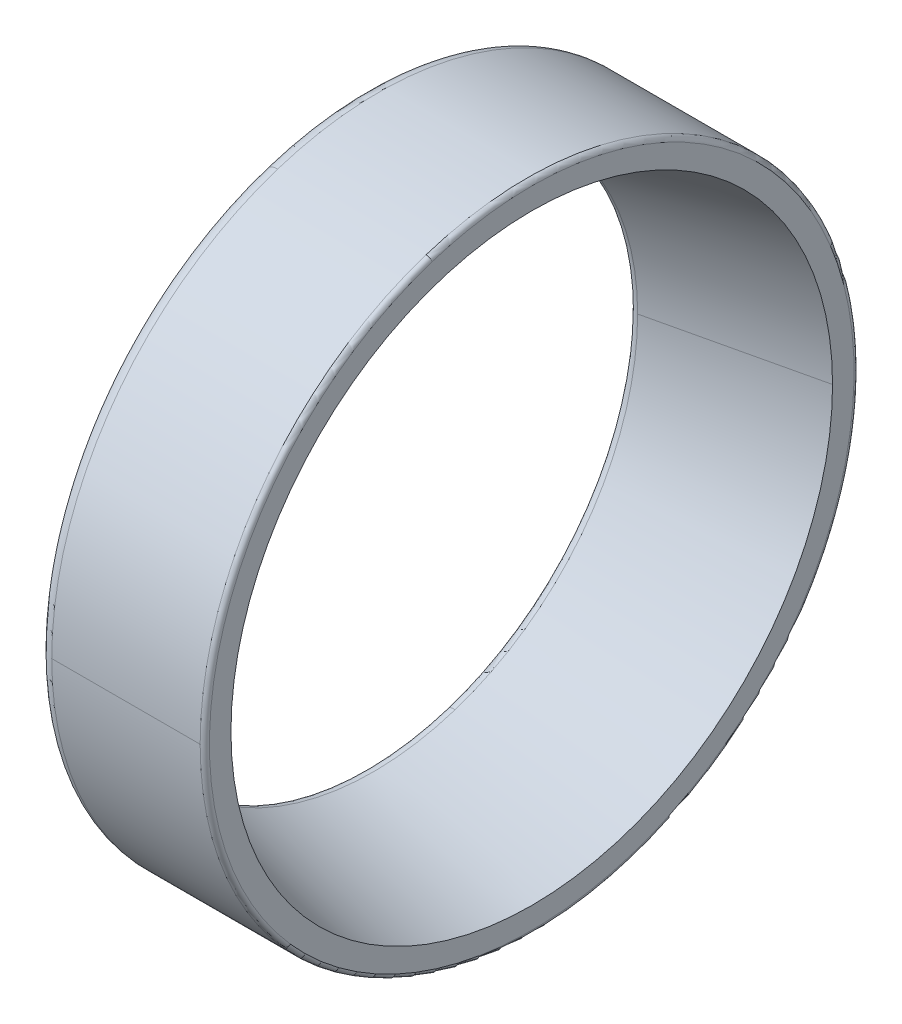
ISO-10303-21;
HEADER;
FILE_DESCRIPTION(('STEP AP214'),'2;1');
FILE_NAME('part.step','',(''),(''),'','','');
FILE_SCHEMA(('AUTOMOTIVE_DESIGN { 1 0 10303 214 1 1 1 1 }'));
ENDSEC;
DATA;
#1=APPLICATION_CONTEXT('core data for automotive mechanical design processes');
#2=APPLICATION_PROTOCOL_DEFINITION('international standard','automotive_design',2000,#1);
#3=PRODUCT_CONTEXT('',#1,'mechanical');
#4=PRODUCT('Part','Part','',(#3));
#5=PRODUCT_RELATED_PRODUCT_CATEGORY('part','',(#4));
#6=PRODUCT_DEFINITION_FORMATION('','',#4);
#7=PRODUCT_DEFINITION_CONTEXT('part definition',#1,'design');
#8=PRODUCT_DEFINITION('design','',#6,#7);
#9=PRODUCT_DEFINITION_SHAPE('','',#8);
#10=(LENGTH_UNIT() NAMED_UNIT(*) SI_UNIT(.MILLI.,.METRE.));
#11=(NAMED_UNIT(*) PLANE_ANGLE_UNIT() SI_UNIT($,.RADIAN.));
#12=(NAMED_UNIT(*) SI_UNIT($,.STERADIAN.) SOLID_ANGLE_UNIT());
#13=UNCERTAINTY_MEASURE_WITH_UNIT(LENGTH_MEASURE(1.E-05),#10,'distance_accuracy_value','');
#14=(GEOMETRIC_REPRESENTATION_CONTEXT(3) GLOBAL_UNCERTAINTY_ASSIGNED_CONTEXT((#13)) GLOBAL_UNIT_ASSIGNED_CONTEXT((#10,
#11,#12)) REPRESENTATION_CONTEXT('',''));
#15=CARTESIAN_POINT('',(0.,0.,0.));
#16=DIRECTION('',(0.,0.,1.));
#17=DIRECTION('',(1.,0.,0.));
#18=AXIS2_PLACEMENT_3D('',#15,#16,#17);
#19=CARTESIAN_POINT('',(0.,22.5,0.));
#20=DIRECTION('',(-1.,0.,0.));
#21=DIRECTION('',(0.,0.,1.));
#22=AXIS2_PLACEMENT_3D('',#19,#20,#21);
#23=PLANE('',#22);
#24=CARTESIAN_POINT('',(0.,0.,0.));
#25=DIRECTION('',(1.,0.,0.));
#26=DIRECTION('',(0.,0.,-1.));
#27=AXIS2_PLACEMENT_3D('',#24,#25,#26);
#28=CIRCLE('',#27,19.487480423777);
#29=CARTESIAN_POINT('',(0.,18.5336952432076,6.02196262849627));
#30=VERTEX_POINT('',#29);
#31=CARTESIAN_POINT('',(0.,-18.5336952432076,-6.02196262849627));
#32=VERTEX_POINT('',#31);
#33=EDGE_CURVE('E11',#30,#32,#28,.T.);
#34=ORIENTED_EDGE('',*,*,#33,.T.);
#35=CARTESIAN_POINT('',(0.,-18.5336952432074,-6.02196262849619));
#36=CARTESIAN_POINT('',(0.,-17.5877291455787,-8.93320142960304));
#37=CARTESIAN_POINT('',(0.,-16.070378082171,-11.6588767741421));
#38=CARTESIAN_POINT('',(0.,-14.0292300530316,-14.0486252637431));
#39=CARTESIAN_POINT('',(0.,-9.11994508389256,-17.8988932024731));
#40=CARTESIAN_POINT('',(0.,-3.11940368420394,-19.6074771216242));
#41=CARTESIAN_POINT('',(0.,0.0137152340265213,-19.8540642709582));
#42=CARTESIAN_POINT('',(0.,6.20765248041568,-19.1051898434805));
#43=CARTESIAN_POINT('',(0.,11.6588303191269,-16.0703370149102));
#44=CARTESIAN_POINT('',(0.,14.0486364795895,-14.0292427266901));
#45=CARTESIAN_POINT('',(0.,17.8988960174071,-9.11993955927373));
#46=CARTESIAN_POINT('',(0.,19.60746027591,-3.11940205978312));
#47=CARTESIAN_POINT('',(0.,19.854124800643,0.013701789860014));
#48=CARTESIAN_POINT('',(0.,19.4795758273155,3.11069604236225));
#49=CARTESIAN_POINT('',(0.,18.5336952432074,6.02196262849619));
#50=B_SPLINE_CURVE_WITH_KNOTS('',5,(#35,#36,#37,#38,#39,#40,#41,#42,#43,#44,#45,#46,#47,#48,
#49),.UNSPECIFIED.,.F.,.F.,(6,3,3,3,6),(0.,0.785398163397448,1.5707963267949,2.35619449019234,
3.14159265358979),.UNSPECIFIED.);
#51=EDGE_CURVE('E26',#32,#30,#50,.T.);
#52=ORIENTED_EDGE('',*,*,#51,.T.);
#53=EDGE_LOOP('',(#34,#52));
#54=FACE_BOUND('',#53,.T.);
#55=CARTESIAN_POINT('',(0.,21.3987716166417,6.95288237343662));
#56=CARTESIAN_POINT('',(0.,21.2850126572293,7.3030217220911));
#57=CARTESIAN_POINT('',(0.,21.1626456683913,7.65036345373054));
#58=CARTESIAN_POINT('',(0.,20.9010225138833,8.33862710388886));
#59=CARTESIAN_POINT('',(0.,20.7617663482132,8.67954902240772));
#60=CARTESIAN_POINT('',(0.,20.4666917220594,9.35414846723436));
#61=CARTESIAN_POINT('',(0.,20.3108732615757,9.68782599354214));
#62=CARTESIAN_POINT('',(0.,19.983051730017,10.3471336713047));
#63=CARTESIAN_POINT('',(0.,19.8110486589419,10.6727638227596));
#64=CARTESIAN_POINT('',(0.,19.4512716593353,11.3151920446043));
#65=CARTESIAN_POINT('',(0.,19.2634977308038,11.6319901149941));
#66=CARTESIAN_POINT('',(0.,18.872631545538,12.2559910432847));
#67=CARTESIAN_POINT('',(0.,18.6695392888038,12.5631939011855));
#68=CARTESIAN_POINT('',(0.,18.2485256698456,13.167264309058));
#69=CARTESIAN_POINT('',(0.,18.0306043076216,13.4641318590298));
#70=CARTESIAN_POINT('',(0.,17.5804574812093,14.046816475628));
#71=CARTESIAN_POINT('',(0.,17.348232017021,14.3326335422546));
#72=CARTESIAN_POINT('',(0.,16.8700364349816,14.8925286326048));
#73=CARTESIAN_POINT('',(0.,16.6240663171305,15.1666066563284));
#74=CARTESIAN_POINT('',(0.,16.1189739921765,15.7023633832314));
#75=CARTESIAN_POINT('',(0.,15.8598517850736,15.9640420864107));
#76=CARTESIAN_POINT('',(0.,15.329079529481,16.4743697652219));
#77=CARTESIAN_POINT('',(0.,15.0574294809912,16.7230187408537));
#78=CARTESIAN_POINT('',(0.,14.5022559714466,17.2066879474317));
#79=CARTESIAN_POINT('',(0.,14.2187325103917,17.441708178378));
#80=CARTESIAN_POINT('',(0.,13.6404952085518,17.8975537112569));
#81=CARTESIAN_POINT('',(0.,13.3457813677667,18.1183790131896));
#82=CARTESIAN_POINT('',(0.,12.7458732979272,18.5453027005488));
#83=CARTESIAN_POINT('',(0.,12.4406790688728,18.7514010859753));
#84=CARTESIAN_POINT('',(0.,11.820545462123,19.148374431259));
#85=CARTESIAN_POINT('',(0.,11.5056060844276,19.3392493911163));
#86=CARTESIAN_POINT('',(0.,10.8667408969425,19.7053160507647));
#87=CARTESIAN_POINT('',(0.,10.5428150871529,19.8805077505558));
#88=CARTESIAN_POINT('',(0.,9.8867574011274,20.2147858379222));
#89=CARTESIAN_POINT('',(0.,9.55462552489164,20.3738722254975));
#90=CARTESIAN_POINT('',(0.,8.88295584075523,20.6755564353901));
#91=CARTESIAN_POINT('',(0.,8.54341803285459,20.8181542577074));
#92=CARTESIAN_POINT('',(0.,7.85775446170765,21.0865178064402));
#93=CARTESIAN_POINT('',(0.,7.51162869846135,21.2122835328557));
#94=CARTESIAN_POINT('',(0.,6.81362306390381,21.4466799091339));
#95=CARTESIAN_POINT('',(0.,6.46174319259256,21.5553105589966));
#96=CARTESIAN_POINT('',(0.,5.75307705133613,21.7551750814191));
#97=CARTESIAN_POINT('',(0.,5.39629078139096,21.8464089539787));
#98=CARTESIAN_POINT('',(0.,4.67867137224175,22.0112601314049));
#99=CARTESIAN_POINT('',(0.,4.31783823303773,22.0848774362713));
#100=CARTESIAN_POINT('',(0.,3.59299436400842,22.2143181277754));
#101=CARTESIAN_POINT('',(0.,3.22898363418315,22.2701415144131));
#102=CARTESIAN_POINT('',(0.,2.49866151764307,22.3638598860317));
#103=CARTESIAN_POINT('',(0.,2.13235013092826,22.4017548710126));
#104=CARTESIAN_POINT('',(0.,1.39830917682481,22.4595251469797));
#105=CARTESIAN_POINT('',(0.,1.03057960943616,22.4794004379659));
#106=CARTESIAN_POINT('',(0.,0.294588186722153,22.5010834446266));
#107=CARTESIAN_POINT('',(0.,-0.0736736686031969,22.5028911603012));
#108=CARTESIAN_POINT('',(0.,-0.809842492125187,22.4884346613933));
#109=CARTESIAN_POINT('',(0.,-1.17774946032183,22.4721704468109));
#110=CARTESIAN_POINT('',(0.,-1.91232218947517,22.4216092693064));
#111=CARTESIAN_POINT('',(0.,-2.27898795043188,22.3873123063845));
#112=CARTESIAN_POINT('',(0.,-3.01019493517108,22.3007682565888));
#113=CARTESIAN_POINT('',(0.,-3.37473615895357,22.2485211697151));
#114=CARTESIAN_POINT('',(0.,-4.10081585760622,22.1262027398244));
#115=CARTESIAN_POINT('',(0.,-4.46235433247637,22.0561313968075));
#116=CARTESIAN_POINT('',(0.,-5.18155755545134,21.8983332626333));
#117=CARTESIAN_POINT('',(0.,-5.53922230355615,21.8106064714761));
#118=CARTESIAN_POINT('',(0.,-6.24981642729453,21.6177087825451));
#119=CARTESIAN_POINT('',(0.,-6.60274580292809,21.5125378847714));
#120=CARTESIAN_POINT('',(0.,-7.30301894394511,21.285005348512));
#121=CARTESIAN_POINT('',(0.,-7.65036270932856,21.1626437100265));
#122=CARTESIAN_POINT('',(0.,-8.33862784829081,20.9010244722482));
#123=CARTESIAN_POINT('',(0.,-8.67954922186961,20.7617668729554));
#124=CARTESIAN_POINT('',(0.,-9.35414826777243,20.4666911973171));
#125=CARTESIAN_POINT('',(0.,-9.68782594009646,20.3108731209715));
#126=CARTESIAN_POINT('',(0.,-10.3471337247504,19.9830518706213));
#127=CARTESIAN_POINT('',(0.,-10.6727638370803,19.8110486966167));
#128=CARTESIAN_POINT('',(0.,-11.3151920302835,19.4512716216605));
#129=CARTESIAN_POINT('',(0.,-11.6319901111569,19.2634977207089));
#130=CARTESIAN_POINT('',(0.,-12.255991047122,18.872631555633));
#131=CARTESIAN_POINT('',(0.,-12.5631939022137,18.6695392915087));
#132=CARTESIAN_POINT('',(0.,-13.1672643080298,18.2485256671407));
#133=CARTESIAN_POINT('',(0.,-13.4641318587542,18.0306043068968));
#134=CARTESIAN_POINT('',(0.,-14.0468164759035,17.5804574819341));
#135=CARTESIAN_POINT('',(0.,-14.3326335423284,17.3482320172152));
#136=CARTESIAN_POINT('',(0.,-14.892528632531,16.8700364347874));
#137=CARTESIAN_POINT('',(0.,-15.1666066563086,16.6240663170784));
#138=CARTESIAN_POINT('',(0.,-15.7023633832512,16.1189739922286));
#139=CARTESIAN_POINT('',(0.,-15.964042086416,15.8598517850876));
#140=CARTESIAN_POINT('',(0.,-16.4743697652165,15.3290795294671));
#141=CARTESIAN_POINT('',(0.,-16.7230187408522,15.0574294809875));
#142=CARTESIAN_POINT('',(0.,-17.2066879474331,14.5022559714503));
#143=CARTESIAN_POINT('',(0.,-17.4417081783783,14.2187325103927));
#144=CARTESIAN_POINT('',(0.,-17.8975537112565,13.6404952085508));
#145=CARTESIAN_POINT('',(0.,-18.1183790131895,13.3457813677665));
#146=CARTESIAN_POINT('',(0.,-18.5453027005489,12.7458732979275));
#147=CARTESIAN_POINT('',(0.,-18.7514010859753,12.4406790688729));
#148=CARTESIAN_POINT('',(0.,-19.148374431259,11.8205454621229));
#149=CARTESIAN_POINT('',(0.,-19.3392493911162,11.5056060844276));
#150=CARTESIAN_POINT('',(0.,-19.7053160507647,10.8667408969426));
#151=CARTESIAN_POINT('',(0.,-19.8805077505558,10.5428150871529));
#152=CARTESIAN_POINT('',(0.,-20.2147858379222,9.88675740112742));
#153=CARTESIAN_POINT('',(0.,-20.3738722254974,9.55462552489166));
#154=CARTESIAN_POINT('',(0.,-20.6755564353901,8.88295584075524));
#155=CARTESIAN_POINT('',(0.,-20.8181542577075,8.54341803285458));
#156=CARTESIAN_POINT('',(0.,-21.0865178064402,7.85775446170769));
#157=CARTESIAN_POINT('',(0.,-21.2122835328554,7.51162869846145));
#158=CARTESIAN_POINT('',(0.,-21.4466799091341,6.81362306390375));
#159=CARTESIAN_POINT('',(0.,-21.5553105589977,6.4617431925923));
#160=CARTESIAN_POINT('',(0.,-21.755175081418,5.75307705133644));
#161=CARTESIAN_POINT('',(0.,-21.8464089539749,5.39629078139203));
#162=CARTESIAN_POINT('',(0.,-22.0112601314087,4.67867137224073));
#163=CARTESIAN_POINT('',(0.,-22.0848774362857,4.31783823303385));
#164=CARTESIAN_POINT('',(0.,-22.214318127761,3.59299436401236));
#165=CARTESIAN_POINT('',(0.,-22.2701415143594,3.22898363419775));
#166=CARTESIAN_POINT('',(0.,-22.3638598860854,2.4986615176285));
#167=CARTESIAN_POINT('',(0.,-22.4017548712131,2.13235013087385));
#168=CARTESIAN_POINT('',(0.,-22.4595251467792,1.39830917687925));
#169=CARTESIAN_POINT('',(0.,-22.4794004372176,1.03057960963931));
#170=CARTESIAN_POINT('',(0.,-22.5010834453749,0.294588186519042));
#171=CARTESIAN_POINT('',(0.,-22.5028911630939,-0.0736736693612757));
#172=CARTESIAN_POINT('',(0.,-22.4884346586006,-0.809842491367064));
#173=CARTESIAN_POINT('',(0.,-22.4721704363884,-1.17774945749253));
#174=CARTESIAN_POINT('',(0.,-22.4216092797289,-1.91232219230443));
#175=CARTESIAN_POINT('',(0.,-22.3873123452815,-2.27898796099085));
#176=CARTESIAN_POINT('',(0.,-22.3007682176917,-3.01019492461208));
#177=CARTESIAN_POINT('',(0.,-22.2485210245492,-3.37473611954689));
#178=CARTESIAN_POINT('',(0.,-22.1262028849902,-4.10081589701288));
#179=CARTESIAN_POINT('',(0.,-22.0561319385737,-4.46235447954406));
#180=CARTESIAN_POINT('',(0.,-21.8983327208671,-5.18155740838361));
#181=CARTESIAN_POINT('',(0.,-21.8106044495771,-5.53922175469199));
#182=CARTESIAN_POINT('',(0.,-21.6177108044441,-6.24981697615866));
#183=CARTESIAN_POINT('',(0.,-21.512545430601,-6.60274785131695));
#184=CARTESIAN_POINT('',(0.,-21.3987716166417,-6.95288237343658));
#185=B_SPLINE_CURVE_WITH_KNOTS('',3,(#55,#56,#57,#58,#59,#60,#61,#62,#63,#64,#65,#66,#67,#68,
#69,#70,#71,#72,#73,#74,#75,#76,#77,#78,#79,#80,#81,#82,#83,#84,#85,#86,#87,#88,#89,#90,#91,#92,
#93,#94,#95,#96,#97,#98,#99,#100,#101,#102,#103,#104,#105,#106,#107,#108,#109,#110,#111,#112,
#113,#114,#115,#116,#117,#118,#119,#120,#121,#122,#123,#124,#125,#126,#127,#128,#129,#130,#131,
#132,#133,#134,#135,#136,#137,#138,#139,#140,#141,#142,#143,#144,#145,#146,#147,#148,#149,#150,
#151,#152,#153,#154,#155,#156,#157,#158,#159,#160,#161,#162,#163,#164,#165,#166,#167,#168,#169,
#170,#171,#172,#173,#174,#175,#176,#177,#178,#179,#180,#181,#182,#183,#184),.UNSPECIFIED.,.F.,
.F.,(4,2,2,2,2,2,2,2,2,2,2,2,2,2,2,2,2,2,2,2,2,2,2,2,2,2,2,2,2,2,2,2,2,2,2,2,2,2,2,2,2,2,2,2,2,
2,2,2,2,2,2,2,2,2,2,2,2,2,2,2,2,2,2,2,4),(0.,1.10435528353109,2.20871056706218,3.31306585059328,
4.41742113412437,5.52177641765546,6.62613170118655,7.73048698471764,8.83484226824874,
9.93919755177983,11.0435528353109,12.147908118842,13.2522634023731,14.3566186859042,
15.4609739694353,16.5653292529664,17.6696845364975,18.7740398200286,19.8783951035597,
20.9827503870907,22.0871056706218,23.1914609541529,24.295816237684,25.4001715212151,
26.5045268047462,27.6088820882773,28.7132373718084,29.8175926553395,30.9219479388706,
32.0263032224017,33.1306585059328,34.2350137894638,35.3393690729949,36.443724356526,
37.5480796400571,38.6524349235882,39.7567902071193,40.8611454906504,41.9655007741815,
43.0698560577126,44.1742113412437,45.2785666247748,46.3829219083059,47.487277191837,
48.591632475368,49.6959877588991,50.8003430424302,51.9046983259613,53.0090536094924,
54.1134088930235,55.2177641765546,56.3221194600857,57.4264747436168,58.5308300271479,
59.6351853106789,60.7395405942101,61.8438958777411,62.9482511612722,64.0526064448033,
65.1569617283344,66.2613170118655,67.3656722953966,68.4700275789277,69.5743828624588,
70.6787381459899),.UNSPECIFIED.);
#186=CARTESIAN_POINT('',(0.,21.3987716166417,6.95288237343656));
#187=VERTEX_POINT('',#186);
#188=CARTESIAN_POINT('',(0.,-21.3987716166417,-6.95288237343656));
#189=VERTEX_POINT('',#188);
#190=EDGE_CURVE('E200',#187,#189,#185,.T.);
#191=ORIENTED_EDGE('',*,*,#190,.F.);
#192=CARTESIAN_POINT('',(0.,-21.3987716166417,-6.95288237343662));
#193=CARTESIAN_POINT('',(0.,-21.2850126572293,-7.3030217220911));
#194=CARTESIAN_POINT('',(0.,-21.1626456683913,-7.65036345373054));
#195=CARTESIAN_POINT('',(0.,-20.9010225138833,-8.33862710388885));
#196=CARTESIAN_POINT('',(0.,-20.7617663482132,-8.67954902240772));
#197=CARTESIAN_POINT('',(0.,-20.4666917220594,-9.35414846723436));
#198=CARTESIAN_POINT('',(0.,-20.3108732615758,-9.68782599354213));
#199=CARTESIAN_POINT('',(0.,-19.983051730017,-10.3471336713047));
#200=CARTESIAN_POINT('',(0.,-19.8110486589419,-10.6727638227596));
#201=CARTESIAN_POINT('',(0.,-19.4512716593353,-11.3151920446043));
#202=CARTESIAN_POINT('',(0.,-19.2634977308038,-11.6319901149941));
#203=CARTESIAN_POINT('',(0.,-18.8726315455381,-12.2559910432847));
#204=CARTESIAN_POINT('',(0.,-18.6695392888038,-12.5631939011855));
#205=CARTESIAN_POINT('',(0.,-18.2485256698456,-13.167264309058));
#206=CARTESIAN_POINT('',(0.,-18.0306043076216,-13.4641318590298));
#207=CARTESIAN_POINT('',(0.,-17.5804574812093,-14.046816475628));
#208=CARTESIAN_POINT('',(0.,-17.348232017021,-14.3326335422546));
#209=CARTESIAN_POINT('',(0.,-16.8700364349816,-14.8925286326048));
#210=CARTESIAN_POINT('',(0.,-16.6240663171305,-15.1666066563284));
#211=CARTESIAN_POINT('',(0.,-16.1189739921765,-15.7023633832314));
#212=CARTESIAN_POINT('',(0.,-15.8598517850736,-15.9640420864107));
#213=CARTESIAN_POINT('',(0.,-15.329079529481,-16.4743697652218));
#214=CARTESIAN_POINT('',(0.,-15.0574294809913,-16.7230187408537));
#215=CARTESIAN_POINT('',(0.,-14.5022559714466,-17.2066879474317));
#216=CARTESIAN_POINT('',(0.,-14.2187325103917,-17.4417081783779));
#217=CARTESIAN_POINT('',(0.,-13.6404952085518,-17.8975537112569));
#218=CARTESIAN_POINT('',(0.,-13.3457813677667,-18.1183790131896));
#219=CARTESIAN_POINT('',(0.,-12.7458732979273,-18.5453027005488));
#220=CARTESIAN_POINT('',(0.,-12.4406790688728,-18.7514010859753));
#221=CARTESIAN_POINT('',(0.,-11.820545462123,-19.148374431259));
#222=CARTESIAN_POINT('',(0.,-11.5056060844276,-19.3392493911162));
#223=CARTESIAN_POINT('',(0.,-10.8667408969426,-19.7053160507646));
#224=CARTESIAN_POINT('',(0.,-10.5428150871529,-19.8805077505558));
#225=CARTESIAN_POINT('',(0.,-9.88675740112742,-20.2147858379222));
#226=CARTESIAN_POINT('',(0.,-9.55462552489166,-20.3738722254975));
#227=CARTESIAN_POINT('',(0.,-8.88295584075525,-20.6755564353901));
#228=CARTESIAN_POINT('',(0.,-8.54341803285461,-20.8181542577074));
#229=CARTESIAN_POINT('',(0.,-7.85775446170767,-21.0865178064402));
#230=CARTESIAN_POINT('',(0.,-7.51162869846137,-21.2122835328557));
#231=CARTESIAN_POINT('',(0.,-6.81362306390383,-21.4466799091338));
#232=CARTESIAN_POINT('',(0.,-6.46174319259258,-21.5553105589966));
#233=CARTESIAN_POINT('',(0.,-5.75307705133616,-21.7551750814191));
#234=CARTESIAN_POINT('',(0.,-5.39629078139098,-21.8464089539787));
#235=CARTESIAN_POINT('',(0.,-4.67867137224178,-22.0112601314049));
#236=CARTESIAN_POINT('',(0.,-4.31783823303776,-22.0848774362713));
#237=CARTESIAN_POINT('',(0.,-3.59299436400846,-22.2143181277754));
#238=CARTESIAN_POINT('',(0.,-3.22898363418318,-22.2701415144131));
#239=CARTESIAN_POINT('',(0.,-2.4986615176431,-22.3638598860317));
#240=CARTESIAN_POINT('',(0.,-2.1323501309283,-22.4017548710126));
#241=CARTESIAN_POINT('',(0.,-1.39830917682484,-22.4595251469797));
#242=CARTESIAN_POINT('',(0.,-1.03057960943618,-22.4794004379659));
#243=CARTESIAN_POINT('',(0.,-0.294588186722179,-22.5010834446266));
#244=CARTESIAN_POINT('',(0.,0.0736736686031675,-22.5028911603012));
#245=CARTESIAN_POINT('',(0.,0.809842492125155,-22.4884346613933));
#246=CARTESIAN_POINT('',(0.,1.1777494603218,-22.4721704468109));
#247=CARTESIAN_POINT('',(0.,1.91232218947514,-22.4216092693064));
#248=CARTESIAN_POINT('',(0.,2.27898795043184,-22.3873123063845));
#249=CARTESIAN_POINT('',(0.,3.01019493517104,-22.3007682565888));
#250=CARTESIAN_POINT('',(0.,3.37473615895353,-22.2485211697151));
#251=CARTESIAN_POINT('',(0.,4.10081585760618,-22.1262027398244));
#252=CARTESIAN_POINT('',(0.,4.46235433247633,-22.0561313968075));
#253=CARTESIAN_POINT('',(0.,5.1815575554513,-21.8983332626333));
#254=CARTESIAN_POINT('',(0.,5.53922230355611,-21.8106064714761));
#255=CARTESIAN_POINT('',(0.,6.24981642729449,-21.6177087825451));
#256=CARTESIAN_POINT('',(0.,6.60274580292805,-21.5125378847714));
#257=CARTESIAN_POINT('',(0.,7.30301894394506,-21.2850053485121));
#258=CARTESIAN_POINT('',(0.,7.65036270932851,-21.1626437100265));
#259=CARTESIAN_POINT('',(0.,8.33862784829076,-20.9010244722482));
#260=CARTESIAN_POINT('',(0.,8.67954922186957,-20.7617668729555));
#261=CARTESIAN_POINT('',(0.,9.3541482677724,-20.4666911973171));
#262=CARTESIAN_POINT('',(0.,9.68782594009643,-20.3108731209715));
#263=CARTESIAN_POINT('',(0.,10.3471337247504,-19.9830518706213));
#264=CARTESIAN_POINT('',(0.,10.6727638370802,-19.8110486966167));
#265=CARTESIAN_POINT('',(0.,11.3151920302835,-19.4512716216605));
#266=CARTESIAN_POINT('',(0.,11.6319901111568,-19.2634977207089));
#267=CARTESIAN_POINT('',(0.,12.2559910471219,-18.872631555633));
#268=CARTESIAN_POINT('',(0.,12.5631939022136,-18.6695392915088));
#269=CARTESIAN_POINT('',(0.,13.1672643080298,-18.2485256671407));
#270=CARTESIAN_POINT('',(0.,13.4641318587542,-18.0306043068969));
#271=CARTESIAN_POINT('',(0.,14.0468164759035,-17.5804574819341));
#272=CARTESIAN_POINT('',(0.,14.3326335423284,-17.3482320172152));
#273=CARTESIAN_POINT('',(0.,14.8925286325309,-16.8700364347874));
#274=CARTESIAN_POINT('',(0.,15.1666066563086,-16.6240663170785));
#275=CARTESIAN_POINT('',(0.,15.7023633832511,-16.1189739922286));
#276=CARTESIAN_POINT('',(0.,15.964042086416,-15.8598517850876));
#277=CARTESIAN_POINT('',(0.,16.4743697652165,-15.3290795294671));
#278=CARTESIAN_POINT('',(0.,16.7230187408522,-15.0574294809876));
#279=CARTESIAN_POINT('',(0.,17.2066879474331,-14.5022559714504));
#280=CARTESIAN_POINT('',(0.,17.4417081783783,-14.2187325103927));
#281=CARTESIAN_POINT('',(0.,17.8975537112565,-13.6404952085508));
#282=CARTESIAN_POINT('',(0.,18.1183790131894,-13.3457813677665));
#283=CARTESIAN_POINT('',(0.,18.5453027005488,-12.7458732979276));
#284=CARTESIAN_POINT('',(0.,18.7514010859753,-12.440679068873));
#285=CARTESIAN_POINT('',(0.,19.1483744312589,-11.820545462123));
#286=CARTESIAN_POINT('',(0.,19.3392493911162,-11.5056060844277));
#287=CARTESIAN_POINT('',(0.,19.7053160507646,-10.8667408969426));
#288=CARTESIAN_POINT('',(0.,19.8805077505558,-10.5428150871529));
#289=CARTESIAN_POINT('',(0.,20.2147858379222,-9.88675740112747));
#290=CARTESIAN_POINT('',(0.,20.3738722254974,-9.55462552489171));
#291=CARTESIAN_POINT('',(0.,20.6755564353901,-8.8829558407553));
#292=CARTESIAN_POINT('',(0.,20.8181542577075,-8.54341803285464));
#293=CARTESIAN_POINT('',(0.,21.0865178064401,-7.85775446170774));
#294=CARTESIAN_POINT('',(0.,21.2122835328554,-7.51162869846151));
#295=CARTESIAN_POINT('',(0.,21.4466799091341,-6.81362306390381));
#296=CARTESIAN_POINT('',(0.,21.5553105589976,-6.46174319259236));
#297=CARTESIAN_POINT('',(0.,21.755175081418,-5.7530770513365));
#298=CARTESIAN_POINT('',(0.,21.8464089539749,-5.39629078139208));
#299=CARTESIAN_POINT('',(0.,22.0112601314087,-4.67867137224079));
#300=CARTESIAN_POINT('',(0.,22.0848774362857,-4.31783823303391));
#301=CARTESIAN_POINT('',(0.,22.214318127761,-3.59299436401243));
#302=CARTESIAN_POINT('',(0.,22.2701415143593,-3.22898363419783));
#303=CARTESIAN_POINT('',(0.,22.3638598860854,-2.49866151762858));
#304=CARTESIAN_POINT('',(0.,22.4017548712131,-2.13235013087393));
#305=CARTESIAN_POINT('',(0.,22.4595251467792,-1.39830917687933));
#306=CARTESIAN_POINT('',(0.,22.4794004372176,-1.03057960963939));
#307=CARTESIAN_POINT('',(0.,22.5010834453749,-0.294588186519124));
#308=CARTESIAN_POINT('',(0.,22.5028911630939,0.0736736693611928));
#309=CARTESIAN_POINT('',(0.,22.4884346586006,0.809842491366981));
#310=CARTESIAN_POINT('',(0.,22.4721704363884,1.17774945749245));
#311=CARTESIAN_POINT('',(0.,22.4216092797289,1.91232219230435));
#312=CARTESIAN_POINT('',(0.,22.3873123452816,2.27898796099077));
#313=CARTESIAN_POINT('',(0.,22.3007682176917,3.010194924612));
#314=CARTESIAN_POINT('',(0.,22.2485210245493,3.37473611954681));
#315=CARTESIAN_POINT('',(0.,22.1262028849902,4.10081589701279));
#316=CARTESIAN_POINT('',(0.,22.0561319385737,4.46235447954398));
#317=CARTESIAN_POINT('',(0.,21.8983327208671,5.18155740838353));
#318=CARTESIAN_POINT('',(0.,21.8106044495771,5.53922175469191));
#319=CARTESIAN_POINT('',(0.,21.6177108044441,6.24981697615858));
#320=CARTESIAN_POINT('',(0.,21.512545430601,6.60274785131687));
#321=CARTESIAN_POINT('',(0.,21.3987716166417,6.9528823734365));
#322=B_SPLINE_CURVE_WITH_KNOTS('',3,(#192,#193,#194,#195,#196,#197,#198,#199,#200,#201,#202,
#203,#204,#205,#206,#207,#208,#209,#210,#211,#212,#213,#214,#215,#216,#217,#218,#219,#220,#221,
#222,#223,#224,#225,#226,#227,#228,#229,#230,#231,#232,#233,#234,#235,#236,#237,#238,#239,#240,
#241,#242,#243,#244,#245,#246,#247,#248,#249,#250,#251,#252,#253,#254,#255,#256,#257,#258,#259,
#260,#261,#262,#263,#264,#265,#266,#267,#268,#269,#270,#271,#272,#273,#274,#275,#276,#277,#278,
#279,#280,#281,#282,#283,#284,#285,#286,#287,#288,#289,#290,#291,#292,#293,#294,#295,#296,#297,
#298,#299,#300,#301,#302,#303,#304,#305,#306,#307,#308,#309,#310,#311,#312,#313,#314,#315,#316,
#317,#318,#319,#320,#321),.UNSPECIFIED.,.F.,.F.,(4,2,2,2,2,2,2,2,2,2,2,2,2,2,2,2,2,2,2,2,2,2,2,
2,2,2,2,2,2,2,2,2,2,2,2,2,2,2,2,2,2,2,2,2,2,2,2,2,2,2,2,2,2,2,2,2,2,2,2,2,2,2,2,2,4),(0.,
1.10435528353109,2.20871056706218,3.31306585059327,4.41742113412436,5.52177641765545,
6.62613170118654,7.73048698471763,8.83484226824873,9.93919755177981,11.0435528353109,
12.147908118842,13.2522634023731,14.3566186859042,15.4609739694353,16.5653292529664,
17.6696845364974,18.7740398200285,19.8783951035596,20.9827503870907,22.0871056706218,
23.1914609541529,24.295816237684,25.4001715212151,26.5045268047462,27.6088820882773,
28.7132373718084,29.8175926553394,30.9219479388705,32.0263032224016,33.1306585059327,
34.2350137894638,35.3393690729949,36.443724356526,37.5480796400571,38.6524349235882,
39.7567902071193,40.8611454906503,41.9655007741814,43.0698560577125,44.1742113412436,
45.2785666247747,46.3829219083058,47.4872771918369,48.591632475368,49.6959877588991,
50.8003430424301,51.9046983259612,53.0090536094923,54.1134088930234,55.2177641765545,
56.3221194600856,57.4264747436167,58.5308300271478,59.6351853106789,60.73954059421,
61.8438958777411,62.9482511612721,64.0526064448032,65.1569617283343,66.2613170118654,
67.3656722953965,68.4700275789276,69.5743828624587,70.6787381459898),.UNSPECIFIED.);
#323=EDGE_CURVE('E301',#189,#187,#322,.T.);
#324=ORIENTED_EDGE('',*,*,#323,.F.);
#325=EDGE_LOOP('',(#191,#324));
#326=FACE_BOUND('',#325,.T.);
#327=ADVANCED_FACE('F17',(#54,#326),#23,.T.);
#328=CARTESIAN_POINT('',(0.99999999999922,0.,0.));
#329=DIRECTION('',(1.,0.,0.));
#330=DIRECTION('',(0.,-0.309016994374947,0.951056516295154));
#331=AXIS2_PLACEMENT_3D('',#328,#329,#330);
#332=TOROIDAL_SURFACE('',#331,22.5000000000008,0.99999999999922);
#333=CARTESIAN_POINT('',(0.99999999999922,-21.3987716166417,-6.95288237343656));
#334=DIRECTION('',(0.,0.309016994374947,-0.951056516295154));
#335=DIRECTION('',(7.80153719404707E-13,-0.951056516295154,-0.309016994374947));
#336=AXIS2_PLACEMENT_3D('',#333,#334,#335);
#337=CIRCLE('',#336,0.999999999999219);
#338=CARTESIAN_POINT('',(1.,-22.3498281329361,-7.26189936781127));
#339=VERTEX_POINT('',#338);
#340=EDGE_CURVE('E264',#339,#189,#337,.T.);
#341=ORIENTED_EDGE('',*,*,#340,.T.);
#342=ORIENTED_EDGE('',*,*,#323,.T.);
#343=CARTESIAN_POINT('',(0.99999999999922,21.3987716166417,6.95288237343656));
#344=DIRECTION('',(0.,-0.309016994374947,0.951056516295154));
#345=DIRECTION('',(7.80153719404707E-13,0.951056516295154,0.309016994374947));
#346=AXIS2_PLACEMENT_3D('',#343,#344,#345);
#347=CIRCLE('',#346,0.999999999999219);
#348=CARTESIAN_POINT('',(1.,22.3498281329361,7.26189936781127));
#349=VERTEX_POINT('',#348);
#350=EDGE_CURVE('E260',#349,#187,#347,.T.);
#351=ORIENTED_EDGE('',*,*,#350,.F.);
#352=CARTESIAN_POINT('',(1.,0.,0.));
#353=DIRECTION('',(1.,0.,0.));
#354=DIRECTION('',(0.,0.,-1.));
#355=AXIS2_PLACEMENT_3D('',#352,#353,#354);
#356=CIRCLE('',#355,23.5);
#357=CARTESIAN_POINT('',(1.,0.,-23.5));
#358=VERTEX_POINT('',#357);
#359=EDGE_CURVE('E255',#358,#349,#356,.T.);
#360=ORIENTED_EDGE('',*,*,#359,.F.);
#361=CARTESIAN_POINT('',(1.,0.,0.));
#362=DIRECTION('',(1.,0.,0.));
#363=DIRECTION('',(0.,0.,-1.));
#364=AXIS2_PLACEMENT_3D('',#361,#362,#363);
#365=CIRCLE('',#364,23.5);
#366=EDGE_CURVE('E250',#339,#358,#365,.T.);
#367=ORIENTED_EDGE('',*,*,#366,.F.);
#368=EDGE_LOOP('',(#341,#342,#351,#360,#367));
#369=FACE_BOUND('',#368,.T.);
#370=ADVANCED_FACE('F272',(#369),#332,.T.);
#371=CARTESIAN_POINT('',(12.,0.,0.));
#372=DIRECTION('',(1.,0.,0.));
#373=DIRECTION('',(0.,1.,0.));
#374=AXIS2_PLACEMENT_3D('',#371,#372,#373);
#375=CYLINDRICAL_SURFACE('',#374,23.5);
#376=DIRECTION('',(1.,0.,0.));
#377=VECTOR('',#376,1.);
#378=CARTESIAN_POINT('',(1.,0.,23.5));
#379=LINE('',#378,#377);
#380=CARTESIAN_POINT('',(1.,0.,23.5));
#381=VERTEX_POINT('',#380);
#382=CARTESIAN_POINT('',(11.666666666667,0.,23.5));
#383=VERTEX_POINT('',#382);
#384=EDGE_CURVE('E245',#381,#383,#379,.T.);
#385=ORIENTED_EDGE('',*,*,#384,.F.);
#386=CARTESIAN_POINT('',(1.,0.,0.));
#387=DIRECTION('',(1.,0.,0.));
#388=DIRECTION('',(0.,0.,-1.));
#389=AXIS2_PLACEMENT_3D('',#386,#387,#388);
#390=CIRCLE('',#389,23.5);
#391=EDGE_CURVE('E240',#381,#339,#390,.T.);
#392=ORIENTED_EDGE('',*,*,#391,.T.);
#393=ORIENTED_EDGE('',*,*,#366,.T.);
#394=DIRECTION('',(1.,0.,0.));
#395=VECTOR('',#394,1.);
#396=CARTESIAN_POINT('',(1.,0.,-23.5));
#397=LINE('',#396,#395);
#398=CARTESIAN_POINT('',(11.666666666667,0.,-23.5));
#399=VERTEX_POINT('',#398);
#400=EDGE_CURVE('E236',#358,#399,#397,.T.);
#401=ORIENTED_EDGE('',*,*,#400,.T.);
#402=CARTESIAN_POINT('',(11.666666666667,0.,0.));
#403=DIRECTION('',(1.,0.,0.));
#404=DIRECTION('',(0.,0.,-1.));
#405=AXIS2_PLACEMENT_3D('',#402,#403,#404);
#406=CIRCLE('',#405,23.5);
#407=CARTESIAN_POINT('',(11.666666666667,-22.3498281329361,-7.26189936781126));
#408=VERTEX_POINT('',#407);
#409=EDGE_CURVE('E231',#408,#399,#406,.T.);
#410=ORIENTED_EDGE('',*,*,#409,.F.);
#411=CARTESIAN_POINT('',(11.666666666667,0.,0.));
#412=DIRECTION('',(1.,0.,0.));
#413=DIRECTION('',(0.,0.,-1.));
#414=AXIS2_PLACEMENT_3D('',#411,#412,#413);
#415=CIRCLE('',#414,23.5);
#416=EDGE_CURVE('E226',#383,#408,#415,.T.);
#417=ORIENTED_EDGE('',*,*,#416,.F.);
#418=EDGE_LOOP('',(#385,#392,#393,#401,#410,#417));
#419=FACE_BOUND('',#418,.T.);
#420=ADVANCED_FACE('F281',(#419),#375,.T.);
#421=CARTESIAN_POINT('',(11.666666666666,0.,0.));
#422=DIRECTION('',(1.,0.,0.));
#423=DIRECTION('',(0.,0.309016994374947,-0.951056516295154));
#424=AXIS2_PLACEMENT_3D('',#421,#422,#423);
#425=TOROIDAL_SURFACE('',#424,23.166666666666,0.333333333333956);
#426=CARTESIAN_POINT('',(11.666666666666,-22.0328092941705,-7.15889370301942));
#427=DIRECTION('',(0.,0.309016994374947,-0.951056516295154));
#428=DIRECTION('',(1.,0.,0.));
#429=AXIS2_PLACEMENT_3D('',#426,#427,#428);
#430=CIRCLE('',#429,0.333333333333956);
#431=CARTESIAN_POINT('',(12.,-22.0328092941705,-7.15889370301942));
#432=VERTEX_POINT('',#431);
#433=EDGE_CURVE('E222',#432,#408,#430,.T.);
#434=ORIENTED_EDGE('',*,*,#433,.F.);
#435=CARTESIAN_POINT('',(12.,0.,0.));
#436=DIRECTION('',(1.,0.,0.));
#437=DIRECTION('',(0.,0.,-1.));
#438=AXIS2_PLACEMENT_3D('',#435,#436,#437);
#439=CIRCLE('',#438,23.166666666667);
#440=CARTESIAN_POINT('',(12.,22.0328092941705,7.15889370301942));
#441=VERTEX_POINT('',#440);
#442=EDGE_CURVE('E218',#441,#432,#439,.T.);
#443=ORIENTED_EDGE('',*,*,#442,.F.);
#444=CARTESIAN_POINT('',(11.666666666666,22.0328092941705,7.15889370301942));
#445=DIRECTION('',(0.,-0.309016994374947,0.951056516295154));
#446=DIRECTION('',(1.,0.,0.));
#447=AXIS2_PLACEMENT_3D('',#444,#445,#446);
#448=CIRCLE('',#447,0.333333333333956);
#449=CARTESIAN_POINT('',(11.666666666667,22.3498281329361,7.26189936781126));
#450=VERTEX_POINT('',#449);
#451=EDGE_CURVE('E214',#441,#450,#448,.T.);
#452=ORIENTED_EDGE('',*,*,#451,.T.);
#453=CARTESIAN_POINT('',(11.666666666667,0.,0.));
#454=DIRECTION('',(1.,0.,0.));
#455=DIRECTION('',(0.,0.,-1.));
#456=AXIS2_PLACEMENT_3D('',#453,#454,#455);
#457=CIRCLE('',#456,23.5);
#458=EDGE_CURVE('E209',#450,#383,#457,.T.);
#459=ORIENTED_EDGE('',*,*,#458,.T.);
#460=ORIENTED_EDGE('',*,*,#416,.T.);
#461=EDGE_LOOP('',(#434,#443,#452,#459,#460));
#462=FACE_BOUND('',#461,.T.);
#463=ADVANCED_FACE('F285',(#462),#425,.T.);
#464=CARTESIAN_POINT('',(12.,0.,0.));
#465=DIRECTION('',(1.,0.,0.));
#466=DIRECTION('',(0.,-1.,0.));
#467=AXIS2_PLACEMENT_3D('',#464,#465,#466);
#468=CYLINDRICAL_SURFACE('',#467,23.5);
#469=ORIENTED_EDGE('',*,*,#384,.T.);
#470=ORIENTED_EDGE('',*,*,#458,.F.);
#471=CARTESIAN_POINT('',(11.666666666667,0.,0.));
#472=DIRECTION('',(1.,0.,0.));
#473=DIRECTION('',(0.,0.,-1.));
#474=AXIS2_PLACEMENT_3D('',#471,#472,#473);
#475=CIRCLE('',#474,23.5);
#476=EDGE_CURVE('E204',#399,#450,#475,.T.);
#477=ORIENTED_EDGE('',*,*,#476,.F.);
#478=ORIENTED_EDGE('',*,*,#400,.F.);
#479=ORIENTED_EDGE('',*,*,#359,.T.);
#480=CARTESIAN_POINT('',(1.,0.,0.));
#481=DIRECTION('',(1.,0.,0.));
#482=DIRECTION('',(0.,0.,-1.));
#483=AXIS2_PLACEMENT_3D('',#480,#481,#482);
#484=CIRCLE('',#483,23.5);
#485=EDGE_CURVE('E201',#349,#381,#484,.T.);
#486=ORIENTED_EDGE('',*,*,#485,.T.);
#487=EDGE_LOOP('',(#469,#470,#477,#478,#479,#486));
#488=FACE_BOUND('',#487,.T.);
#489=ADVANCED_FACE('F288',(#488),#468,.T.);
#490=CARTESIAN_POINT('',(0.99999999999922,0.,0.));
#491=DIRECTION('',(1.,0.,0.));
#492=DIRECTION('',(0.,0.309016994374947,-0.951056516295154));
#493=AXIS2_PLACEMENT_3D('',#490,#491,#492);
#494=TOROIDAL_SURFACE('',#493,22.5000000000008,0.99999999999922);
#495=ORIENTED_EDGE('',*,*,#340,.F.);
#496=ORIENTED_EDGE('',*,*,#391,.F.);
#497=ORIENTED_EDGE('',*,*,#485,.F.);
#498=ORIENTED_EDGE('',*,*,#350,.T.);
#499=ORIENTED_EDGE('',*,*,#190,.T.);
#500=EDGE_LOOP('',(#495,#496,#497,#498,#499));
#501=FACE_BOUND('',#500,.T.);
#502=ADVANCED_FACE('F170',(#501),#494,.T.);
#503=CARTESIAN_POINT('',(11.666666666666,0.,0.));
#504=DIRECTION('',(1.,0.,0.));
#505=DIRECTION('',(0.,-0.309016994374947,0.951056516295154));
#506=AXIS2_PLACEMENT_3D('',#503,#504,#505);
#507=TOROIDAL_SURFACE('',#506,23.166666666666,0.333333333333956);
#508=ORIENTED_EDGE('',*,*,#433,.T.);
#509=ORIENTED_EDGE('',*,*,#409,.T.);
#510=ORIENTED_EDGE('',*,*,#476,.T.);
#511=ORIENTED_EDGE('',*,*,#451,.F.);
#512=CARTESIAN_POINT('',(12.,-22.0328092941714,-7.15889370301972));
#513=CARTESIAN_POINT('',(12.,-20.9082472273898,-10.6197669111344));
#514=CARTESIAN_POINT('',(12.,-19.1044241811128,-13.8600427587727));
#515=CARTESIAN_POINT('',(12.,-16.6779126475488,-16.7009696242186));
#516=CARTESIAN_POINT('',(12.,-10.8417672876306,-21.2781582588808));
#517=CARTESIAN_POINT('',(12.,-3.70833908638862,-23.3093184328099));
#518=CARTESIAN_POINT('',(12.,0.0163046349778706,-23.6024606024839));
#519=CARTESIAN_POINT('',(12.,7.3796413219655,-22.7122006068715));
#520=CARTESIAN_POINT('',(12.,13.85998753317,-19.1043753604586));
#521=CARTESIAN_POINT('',(12.,16.700982957588,-16.6779277139615));
#522=CARTESIAN_POINT('',(12.,21.2781616052669,-10.8417607199779));
#523=CARTESIAN_POINT('',(12.,23.3092984066681,-3.70833715528134));
#524=CARTESIAN_POINT('',(12.,23.6025325600176,0.0162886525872494));
#525=CARTESIAN_POINT('',(12.,23.1572697026996,3.69798746413618));
#526=CARTESIAN_POINT('',(12.,22.0328092941714,7.15889370301972));
#527=B_SPLINE_CURVE_WITH_KNOTS('',5,(#512,#513,#514,#515,#516,#517,#518,#519,#520,#521,#522,
#523,#524,#525,#526),.UNSPECIFIED.,.F.,.F.,(6,3,3,3,6),(0.,0.785398163397448,1.5707963267949,
2.35619449019234,3.14159265358979),.UNSPECIFIED.);
#528=EDGE_CURVE('E144',#432,#441,#527,.T.);
#529=ORIENTED_EDGE('',*,*,#528,.F.);
#530=EDGE_LOOP('',(#508,#509,#510,#511,#529));
#531=FACE_BOUND('',#530,.T.);
#532=ADVANCED_FACE('F164',(#531),#507,.T.);
#533=CARTESIAN_POINT('',(12.,21.619475126357,0.));
#534=DIRECTION('',(1.,0.,0.));
#535=DIRECTION('',(0.,0.,-1.));
#536=AXIS2_PLACEMENT_3D('',#533,#534,#535);
#537=PLANE('',#536);
#538=ORIENTED_EDGE('',*,*,#442,.T.);
#539=ORIENTED_EDGE('',*,*,#528,.T.);
#540=EDGE_LOOP('',(#538,#539));
#541=FACE_BOUND('',#540,.T.);
#542=CARTESIAN_POINT('',(12.,0.,0.));
#543=DIRECTION('',(1.,0.,0.));
#544=DIRECTION('',(0.,0.,-1.));
#545=AXIS2_PLACEMENT_3D('',#542,#543,#544);
#546=CIRCLE('',#545,21.619475126357);
#547=CARTESIAN_POINT('',(12.,0.,21.619475126357));
#548=VERTEX_POINT('',#547);
#549=CARTESIAN_POINT('',(12.,0.,-21.619475126357));
#550=VERTEX_POINT('',#549);
#551=EDGE_CURVE('E140',#548,#550,#546,.T.);
#552=ORIENTED_EDGE('',*,*,#551,.F.);
#553=CARTESIAN_POINT('',(12.,0.,0.));
#554=DIRECTION('',(1.,0.,0.));
#555=DIRECTION('',(0.,0.,-1.));
#556=AXIS2_PLACEMENT_3D('',#553,#554,#555);
#557=CIRCLE('',#556,21.619475126357);
#558=EDGE_CURVE('E135',#550,#548,#557,.T.);
#559=ORIENTED_EDGE('',*,*,#558,.F.);
#560=EDGE_LOOP('',(#552,#559));
#561=FACE_BOUND('',#560,.T.);
#562=ADVANCED_FACE('F153',(#541,#561),#537,.T.);
#563=CARTESIAN_POINT('',(0.61207584917893,0.,0.));
#564=DIRECTION('',(1.,0.,0.));
#565=DIRECTION('',(0.,-1.,0.));
#566=AXIS2_PLACEMENT_3D('',#563,#564,#565);
#567=CONICAL_SURFACE('',#566,19.000203291099,0.226072498010833);
#568=DIRECTION('',(0.974554265355851,0.,0.224151698357869));
#569=VECTOR('',#568,1.);
#570=CARTESIAN_POINT('',(0.61207584917893,0.,19.000203291099));
#571=LINE('',#570,#569);
#572=CARTESIAN_POINT('',(0.61207584917893,0.,19.000203291099));
#573=VERTEX_POINT('',#572);
#574=EDGE_CURVE('E131',#573,#548,#571,.T.);
#575=ORIENTED_EDGE('',*,*,#574,.F.);
#576=CARTESIAN_POINT('',(0.61207584917893,0.,0.));
#577=DIRECTION('',(1.,0.,0.));
#578=DIRECTION('',(0.,0.,-1.));
#579=AXIS2_PLACEMENT_3D('',#576,#577,#578);
#580=CIRCLE('',#579,19.000203291099);
#581=CARTESIAN_POINT('',(0.61207584917893,18.0702671509323,5.87138571352839));
#582=VERTEX_POINT('',#581);
#583=EDGE_CURVE('E114',#582,#573,#580,.T.);
#584=ORIENTED_EDGE('',*,*,#583,.F.);
#585=CARTESIAN_POINT('',(0.61207584917893,0.,0.));
#586=DIRECTION('',(1.,0.,0.));
#587=DIRECTION('',(0.,0.,-1.));
#588=AXIS2_PLACEMENT_3D('',#585,#586,#587);
#589=CIRCLE('',#588,19.000203291099);
#590=CARTESIAN_POINT('',(0.61207584917893,0.,-19.000203291099));
#591=VERTEX_POINT('',#590);
#592=EDGE_CURVE('E124',#591,#582,#589,.T.);
#593=ORIENTED_EDGE('',*,*,#592,.F.);
#594=DIRECTION('',(0.974554265355851,0.,-0.224151698357869));
#595=VECTOR('',#594,1.);
#596=CARTESIAN_POINT('',(0.61207584917893,0.,-19.000203291099));
#597=LINE('',#596,#595);
#598=EDGE_CURVE('E102',#591,#550,#597,.T.);
#599=ORIENTED_EDGE('',*,*,#598,.T.);
#600=ORIENTED_EDGE('',*,*,#558,.T.);
#601=EDGE_LOOP('',(#575,#584,#593,#599,#600));
#602=FACE_BOUND('',#601,.T.);
#603=ADVANCED_FACE('F163',(#602),#567,.F.);
#604=CARTESIAN_POINT('',(0.61207584917893,0.,0.));
#605=DIRECTION('',(1.,0.,0.));
#606=DIRECTION('',(0.,1.,0.));
#607=AXIS2_PLACEMENT_3D('',#604,#605,#606);
#608=CONICAL_SURFACE('',#607,19.000203291099,0.226072498010833);
#609=ORIENTED_EDGE('',*,*,#574,.T.);
#610=ORIENTED_EDGE('',*,*,#551,.T.);
#611=ORIENTED_EDGE('',*,*,#598,.F.);
#612=CARTESIAN_POINT('',(0.61207584917893,0.,0.));
#613=DIRECTION('',(1.,0.,0.));
#614=DIRECTION('',(0.,0.,-1.));
#615=AXIS2_PLACEMENT_3D('',#612,#613,#614);
#616=CIRCLE('',#615,19.000203291099);
#617=CARTESIAN_POINT('',(0.612075849178931,-18.0702671509323,-5.87138571352839));
#618=VERTEX_POINT('',#617);
#619=EDGE_CURVE('E93',#618,#591,#616,.T.);
#620=ORIENTED_EDGE('',*,*,#619,.F.);
#621=CARTESIAN_POINT('',(0.61207584917893,0.,0.));
#622=DIRECTION('',(1.,0.,0.));
#623=DIRECTION('',(0.,0.,-1.));
#624=AXIS2_PLACEMENT_3D('',#621,#622,#623);
#625=CIRCLE('',#624,19.000203291099);
#626=EDGE_CURVE('E98',#573,#618,#625,.T.);
#627=ORIENTED_EDGE('',*,*,#626,.F.);
#628=EDGE_LOOP('',(#609,#610,#611,#620,#627));
#629=FACE_BOUND('',#628,.T.);
#630=ADVANCED_FACE('F96',(#629),#608,.F.);
#631=CARTESIAN_POINT('',(0.500000000000259,0.,0.));
#632=DIRECTION('',(1.,0.,0.));
#633=DIRECTION('',(0.,0.309016994374947,-0.951056516295154));
#634=AXIS2_PLACEMENT_3D('',#631,#632,#633);
#635=TOROIDAL_SURFACE('',#634,19.4874804237772,0.500000000000259);
#636=CARTESIAN_POINT('',(0.500000000000259,-18.5336952432076,-6.02196262849627));
#637=DIRECTION('',(0.,0.309016994374947,-0.951056516295154));
#638=DIRECTION('',(-1.,0.,0.));
#639=AXIS2_PLACEMENT_3D('',#636,#637,#638);
#640=CIRCLE('',#639,0.500000000000259);
#641=EDGE_CURVE('E106',#32,#618,#640,.T.);
#642=ORIENTED_EDGE('',*,*,#641,.F.);
#643=ORIENTED_EDGE('',*,*,#33,.F.);
#644=CARTESIAN_POINT('',(0.500000000000259,18.5336952432076,6.02196262849627));
#645=DIRECTION('',(0.,-0.309016994374947,0.951056516295154));
#646=DIRECTION('',(-1.,0.,0.));
#647=AXIS2_PLACEMENT_3D('',#644,#645,#646);
#648=CIRCLE('',#647,0.500000000000259);
#649=EDGE_CURVE('E110',#30,#582,#648,.T.);
#650=ORIENTED_EDGE('',*,*,#649,.T.);
#651=ORIENTED_EDGE('',*,*,#583,.T.);
#652=ORIENTED_EDGE('',*,*,#626,.T.);
#653=EDGE_LOOP('',(#642,#643,#650,#651,#652));
#654=FACE_BOUND('',#653,.T.);
#655=ADVANCED_FACE('F112',(#654),#635,.T.);
#656=CARTESIAN_POINT('',(0.500000000000259,0.,0.));
#657=DIRECTION('',(1.,0.,0.));
#658=DIRECTION('',(0.,-0.309016994374947,0.951056516295154));
#659=AXIS2_PLACEMENT_3D('',#656,#657,#658);
#660=TOROIDAL_SURFACE('',#659,19.4874804237772,0.500000000000259);
#661=ORIENTED_EDGE('',*,*,#641,.T.);
#662=ORIENTED_EDGE('',*,*,#619,.T.);
#663=ORIENTED_EDGE('',*,*,#592,.T.);
#664=ORIENTED_EDGE('',*,*,#649,.F.);
#665=ORIENTED_EDGE('',*,*,#51,.F.);
#666=EDGE_LOOP('',(#661,#662,#663,#664,#665));
#667=FACE_BOUND('',#666,.T.);
#668=ADVANCED_FACE('F107',(#667),#660,.T.);
#669=CLOSED_SHELL('',(#327,#370,#420,#463,#489,#502,#532,#562,#603,#630,#655,#668));
#670=MANIFOLD_SOLID_BREP('B1',#669);
#671=ADVANCED_BREP_SHAPE_REPRESENTATION('',(#18,#670),#14);
#672=SHAPE_DEFINITION_REPRESENTATION(#9,#671);
ENDSEC;
END-ISO-10303-21;
